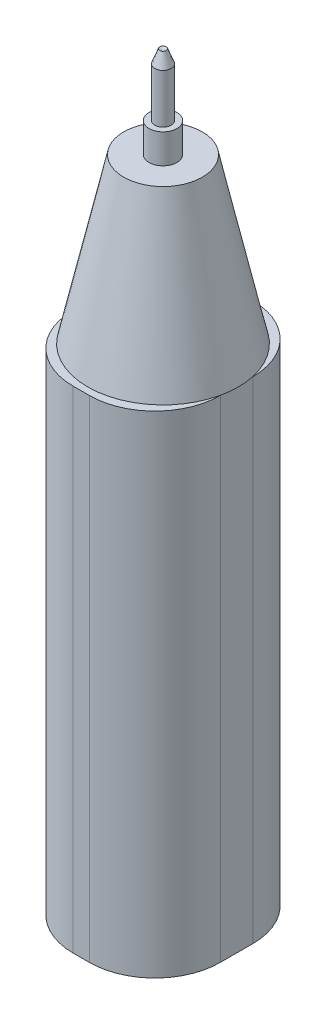
ISO-10303-21;
HEADER;
FILE_DESCRIPTION(('STEP AP214'),'2;1');
FILE_NAME('part.step','',(''),(''),'','','');
FILE_SCHEMA(('AUTOMOTIVE_DESIGN { 1 0 10303 214 1 1 1 1 }'));
ENDSEC;
DATA;
#1=APPLICATION_CONTEXT('core data for automotive mechanical design processes');
#2=APPLICATION_PROTOCOL_DEFINITION('international standard','automotive_design',2000,#1);
#3=PRODUCT_CONTEXT('',#1,'mechanical');
#4=PRODUCT('Part','Part','',(#3));
#5=PRODUCT_RELATED_PRODUCT_CATEGORY('part','',(#4));
#6=PRODUCT_DEFINITION_FORMATION('','',#4);
#7=PRODUCT_DEFINITION_CONTEXT('part definition',#1,'design');
#8=PRODUCT_DEFINITION('design','',#6,#7);
#9=PRODUCT_DEFINITION_SHAPE('','',#8);
#10=(LENGTH_UNIT() NAMED_UNIT(*) SI_UNIT(.MILLI.,.METRE.));
#11=(NAMED_UNIT(*) PLANE_ANGLE_UNIT() SI_UNIT($,.RADIAN.));
#12=(NAMED_UNIT(*) SI_UNIT($,.STERADIAN.) SOLID_ANGLE_UNIT());
#13=UNCERTAINTY_MEASURE_WITH_UNIT(LENGTH_MEASURE(1.E-05),#10,'distance_accuracy_value','');
#14=(GEOMETRIC_REPRESENTATION_CONTEXT(3) GLOBAL_UNCERTAINTY_ASSIGNED_CONTEXT((#13)) GLOBAL_UNIT_ASSIGNED_CONTEXT((#10,
#11,#12)) REPRESENTATION_CONTEXT('',''));
#15=CARTESIAN_POINT('',(0.,0.,0.));
#16=DIRECTION('',(0.,0.,1.));
#17=DIRECTION('',(1.,0.,0.));
#18=AXIS2_PLACEMENT_3D('',#15,#16,#17);
#19=CARTESIAN_POINT('',(0.,209.,0.));
#20=DIRECTION('',(0.,1.,0.));
#21=DIRECTION('',(0.,0.,1.));
#22=AXIS2_PLACEMENT_3D('',#19,#20,#21);
#23=PLANE('',#22);
#24=CARTESIAN_POINT('',(0.,209.,0.));
#25=DIRECTION('',(0.,1.,0.));
#26=DIRECTION('',(0.,0.,1.));
#27=AXIS2_PLACEMENT_3D('',#24,#25,#26);
#28=CIRCLE('',#27,4.25);
#29=CARTESIAN_POINT('',(0.,209.,4.25));
#30=VERTEX_POINT('',#29);
#31=EDGE_CURVE('E284',#30,#30,#28,.T.);
#32=ORIENTED_EDGE('',*,*,#31,.T.);
#33=EDGE_LOOP('',(#32));
#34=FACE_BOUND('',#33,.T.);
#35=CARTESIAN_POINT('',(0.,209.,0.));
#36=DIRECTION('',(0.,1.,0.));
#37=DIRECTION('',(0.,0.,1.));
#38=AXIS2_PLACEMENT_3D('',#35,#36,#37);
#39=CIRCLE('',#38,2.5);
#40=CARTESIAN_POINT('',(0.,209.,2.5));
#41=VERTEX_POINT('',#40);
#42=EDGE_CURVE('E294',#41,#41,#39,.T.);
#43=ORIENTED_EDGE('',*,*,#42,.F.);
#44=EDGE_LOOP('',(#43));
#45=FACE_BOUND('',#44,.T.);
#46=ADVANCED_FACE('F34',(#34,#45),#23,.T.);
#47=CARTESIAN_POINT('',(0.,200.,12.));
#48=DIRECTION('',(0.,1.,0.));
#49=DIRECTION('',(0.,0.,1.));
#50=AXIS2_PLACEMENT_3D('',#47,#48,#49);
#51=PLANE('',#50);
#52=CARTESIAN_POINT('',(0.,200.,0.));
#53=DIRECTION('',(0.,-1.,0.));
#54=DIRECTION('',(0.,0.,-1.));
#55=AXIS2_PLACEMENT_3D('',#52,#53,#54);
#56=CIRCLE('',#55,12.);
#57=CARTESIAN_POINT('',(0.,200.,-12.));
#58=VERTEX_POINT('',#57);
#59=EDGE_CURVE('E291',#58,#58,#56,.T.);
#60=ORIENTED_EDGE('',*,*,#59,.F.);
#61=EDGE_LOOP('',(#60));
#62=FACE_BOUND('',#61,.T.);
#63=CARTESIAN_POINT('',(0.,200.,0.));
#64=DIRECTION('',(0.,1.,0.));
#65=DIRECTION('',(0.,0.,1.));
#66=AXIS2_PLACEMENT_3D('',#63,#64,#65);
#67=CIRCLE('',#66,4.25);
#68=CARTESIAN_POINT('',(0.,200.,4.25));
#69=VERTEX_POINT('',#68);
#70=EDGE_CURVE('E287',#69,#69,#67,.T.);
#71=ORIENTED_EDGE('',*,*,#70,.F.);
#72=EDGE_LOOP('',(#71));
#73=FACE_BOUND('',#72,.T.);
#74=ADVANCED_FACE('F262',(#62,#73),#51,.T.);
#75=CARTESIAN_POINT('',(2.5,150.,-5.));
#76=DIRECTION('',(0.,-1.,0.));
#77=DIRECTION('',(0.,0.,-1.));
#78=AXIS2_PLACEMENT_3D('',#75,#76,#77);
#79=PLANE('',#78);
#80=DIRECTION('',(0.,0.,-1.));
#81=VECTOR('',#80,1.);
#82=CARTESIAN_POINT('',(22.5,150.,5.));
#83=LINE('',#82,#81);
#84=CARTESIAN_POINT('',(22.5,150.,5.));
#85=VERTEX_POINT('',#84);
#86=CARTESIAN_POINT('',(22.5,150.,4.76969600708471));
#87=VERTEX_POINT('',#86);
#88=EDGE_CURVE('E144',#85,#87,#83,.T.);
#89=ORIENTED_EDGE('',*,*,#88,.T.);
#90=CARTESIAN_POINT('',(0.,150.,0.));
#91=DIRECTION('',(0.,-1.,0.));
#92=DIRECTION('',(0.,0.,-1.));
#93=AXIS2_PLACEMENT_3D('',#90,#91,#92);
#94=CIRCLE('',#93,23.);
#95=CARTESIAN_POINT('',(-22.5,150.,4.76969600708475));
#96=VERTEX_POINT('',#95);
#97=EDGE_CURVE('E181',#87,#96,#94,.T.);
#98=ORIENTED_EDGE('',*,*,#97,.T.);
#99=DIRECTION('',(0.,0.,1.));
#100=VECTOR('',#99,1.);
#101=CARTESIAN_POINT('',(-22.5,150.,5.));
#102=LINE('',#101,#100);
#103=CARTESIAN_POINT('',(-22.5,150.,5.));
#104=VERTEX_POINT('',#103);
#105=EDGE_CURVE('E188',#96,#104,#102,.T.);
#106=ORIENTED_EDGE('',*,*,#105,.T.);
#107=CARTESIAN_POINT('',(-2.5,150.,5.));
#108=DIRECTION('',(0.,1.,0.));
#109=DIRECTION('',(0.,0.,-1.));
#110=AXIS2_PLACEMENT_3D('',#107,#108,#109);
#111=CIRCLE('',#110,20.);
#112=CARTESIAN_POINT('',(-2.49999999999999,150.,25.));
#113=VERTEX_POINT('',#112);
#114=EDGE_CURVE('E126',#104,#113,#111,.T.);
#115=ORIENTED_EDGE('',*,*,#114,.T.);
#116=DIRECTION('',(1.,0.,0.));
#117=VECTOR('',#116,1.);
#118=CARTESIAN_POINT('',(-2.5,150.,25.));
#119=LINE('',#118,#117);
#120=CARTESIAN_POINT('',(2.5,150.,25.));
#121=VERTEX_POINT('',#120);
#122=EDGE_CURVE('E118',#113,#121,#119,.T.);
#123=ORIENTED_EDGE('',*,*,#122,.T.);
#124=CARTESIAN_POINT('',(2.5,150.,5.));
#125=DIRECTION('',(0.,1.,0.));
#126=DIRECTION('',(0.,0.,1.));
#127=AXIS2_PLACEMENT_3D('',#124,#125,#126);
#128=CIRCLE('',#127,20.);
#129=EDGE_CURVE('E123',#121,#85,#128,.T.);
#130=ORIENTED_EDGE('',*,*,#129,.T.);
#131=EDGE_LOOP('',(#89,#98,#106,#115,#123,#130));
#132=FACE_BOUND('',#131,.T.);
#133=ADVANCED_FACE('F121',(#132),#79,.F.);
#134=CARTESIAN_POINT('',(2.5,150.,-5.));
#135=DIRECTION('',(0.,-1.,0.));
#136=DIRECTION('',(0.,0.,-1.));
#137=AXIS2_PLACEMENT_3D('',#134,#135,#136);
#138=CYLINDRICAL_SURFACE('',#137,20.);
#139=CARTESIAN_POINT('',(2.5,0.,-5.));
#140=DIRECTION('',(0.,1.,0.));
#141=DIRECTION('',(0.,0.,-1.));
#142=AXIS2_PLACEMENT_3D('',#139,#140,#141);
#143=CIRCLE('',#142,20.);
#144=CARTESIAN_POINT('',(22.5,0.,-5.));
#145=VERTEX_POINT('',#144);
#146=CARTESIAN_POINT('',(2.5,0.,-25.));
#147=VERTEX_POINT('',#146);
#148=EDGE_CURVE('E149',#145,#147,#143,.T.);
#149=ORIENTED_EDGE('',*,*,#148,.T.);
#150=DIRECTION('',(0.,-1.,0.));
#151=VECTOR('',#150,1.);
#152=CARTESIAN_POINT('',(2.5,150.,-25.));
#153=LINE('',#152,#151);
#154=CARTESIAN_POINT('',(2.5,150.,-25.));
#155=VERTEX_POINT('',#154);
#156=EDGE_CURVE('E178',#155,#147,#153,.T.);
#157=ORIENTED_EDGE('',*,*,#156,.F.);
#158=CARTESIAN_POINT('',(2.5,150.,-5.));
#159=DIRECTION('',(0.,1.,0.));
#160=DIRECTION('',(0.,0.,-1.));
#161=AXIS2_PLACEMENT_3D('',#158,#159,#160);
#162=CIRCLE('',#161,20.);
#163=CARTESIAN_POINT('',(22.5,150.,-5.));
#164=VERTEX_POINT('',#163);
#165=EDGE_CURVE('E165',#164,#155,#162,.T.);
#166=ORIENTED_EDGE('',*,*,#165,.F.);
#167=DIRECTION('',(0.,-1.,0.));
#168=VECTOR('',#167,1.);
#169=CARTESIAN_POINT('',(22.5,150.,-5.));
#170=LINE('',#169,#168);
#171=EDGE_CURVE('E148',#164,#145,#170,.T.);
#172=ORIENTED_EDGE('',*,*,#171,.T.);
#173=EDGE_LOOP('',(#149,#157,#166,#172));
#174=FACE_BOUND('',#173,.T.);
#175=ADVANCED_FACE('F36',(#174),#138,.T.);
#176=CARTESIAN_POINT('',(-2.5,150.,-25.));
#177=DIRECTION('',(0.,0.,1.));
#178=DIRECTION('',(1.,0.,0.));
#179=AXIS2_PLACEMENT_3D('',#176,#177,#178);
#180=PLANE('',#179);
#181=DIRECTION('',(-1.,0.,0.));
#182=VECTOR('',#181,1.);
#183=CARTESIAN_POINT('',(-2.5,0.,-25.));
#184=LINE('',#183,#182);
#185=CARTESIAN_POINT('',(-2.5,0.,-25.));
#186=VERTEX_POINT('',#185);
#187=EDGE_CURVE('E152',#147,#186,#184,.T.);
#188=ORIENTED_EDGE('',*,*,#187,.T.);
#189=DIRECTION('',(0.,-1.,0.));
#190=VECTOR('',#189,1.);
#191=CARTESIAN_POINT('',(-2.5,150.,-25.));
#192=LINE('',#191,#190);
#193=CARTESIAN_POINT('',(-2.5,150.,-25.));
#194=VERTEX_POINT('',#193);
#195=EDGE_CURVE('E175',#194,#186,#192,.T.);
#196=ORIENTED_EDGE('',*,*,#195,.F.);
#197=DIRECTION('',(-1.,0.,0.));
#198=VECTOR('',#197,1.);
#199=CARTESIAN_POINT('',(-2.5,150.,-25.));
#200=LINE('',#199,#198);
#201=EDGE_CURVE('E102',#155,#194,#200,.T.);
#202=ORIENTED_EDGE('',*,*,#201,.F.);
#203=ORIENTED_EDGE('',*,*,#156,.T.);
#204=EDGE_LOOP('',(#188,#196,#202,#203));
#205=FACE_BOUND('',#204,.T.);
#206=ADVANCED_FACE('F430',(#205),#180,.F.);
#207=CARTESIAN_POINT('',(-2.5,150.,-5.));
#208=DIRECTION('',(0.,-1.,0.));
#209=DIRECTION('',(0.,0.,-1.));
#210=AXIS2_PLACEMENT_3D('',#207,#208,#209);
#211=CYLINDRICAL_SURFACE('',#210,20.);
#212=CARTESIAN_POINT('',(-2.5,0.,-5.));
#213=DIRECTION('',(0.,1.,0.));
#214=DIRECTION('',(0.,0.,-1.));
#215=AXIS2_PLACEMENT_3D('',#212,#213,#214);
#216=CIRCLE('',#215,20.);
#217=CARTESIAN_POINT('',(-22.5,0.,-5.));
#218=VERTEX_POINT('',#217);
#219=EDGE_CURVE('E155',#186,#218,#216,.T.);
#220=ORIENTED_EDGE('',*,*,#219,.T.);
#221=DIRECTION('',(0.,-1.,0.));
#222=VECTOR('',#221,1.);
#223=CARTESIAN_POINT('',(-22.5,150.,-5.));
#224=LINE('',#223,#222);
#225=CARTESIAN_POINT('',(-22.5,150.,-5.));
#226=VERTEX_POINT('',#225);
#227=EDGE_CURVE('E172',#226,#218,#224,.T.);
#228=ORIENTED_EDGE('',*,*,#227,.F.);
#229=CARTESIAN_POINT('',(-2.5,150.,-5.));
#230=DIRECTION('',(0.,1.,0.));
#231=DIRECTION('',(0.,0.,-1.));
#232=AXIS2_PLACEMENT_3D('',#229,#230,#231);
#233=CIRCLE('',#232,20.);
#234=EDGE_CURVE('E199',#194,#226,#233,.T.);
#235=ORIENTED_EDGE('',*,*,#234,.F.);
#236=ORIENTED_EDGE('',*,*,#195,.T.);
#237=EDGE_LOOP('',(#220,#228,#235,#236));
#238=FACE_BOUND('',#237,.T.);
#239=ADVANCED_FACE('F260',(#238),#211,.T.);
#240=CARTESIAN_POINT('',(-22.5,150.,5.));
#241=DIRECTION('',(1.,0.,0.));
#242=DIRECTION('',(0.,0.,-1.));
#243=AXIS2_PLACEMENT_3D('',#240,#241,#242);
#244=PLANE('',#243);
#245=ORIENTED_EDGE('',*,*,#105,.F.);
#246=CARTESIAN_POINT('',(-22.5,150.945176721953,15.4543097989332));
#247=CARTESIAN_POINT('',(-22.5,150.845980501769,14.6577788421554));
#248=CARTESIAN_POINT('',(-22.5,150.75187678349,13.8605854725635));
#249=CARTESIAN_POINT('',(-22.5,150.575600378426,12.264800911085));
#250=CARTESIAN_POINT('',(-22.5,150.493428937328,11.4662095820513));
#251=CARTESIAN_POINT('',(-22.5,150.342741917008,9.86726999008047));
#252=CARTESIAN_POINT('',(-22.5,150.274234092261,9.06692098861855));
#253=CARTESIAN_POINT('',(-22.5,150.152710200014,7.46506272895871));
#254=CARTESIAN_POINT('',(-22.5,150.099693648549,6.66355350779385));
#255=CARTESIAN_POINT('',(-22.5,150.01100834859,5.06448081675172));
#256=CARTESIAN_POINT('',(-22.5,149.975235530714,4.26692317911145));
#257=CARTESIAN_POINT('',(-22.5,149.921742679699,2.67119239229187));
#258=CARTESIAN_POINT('',(-22.5,149.904022723623,1.87301924049972));
#259=CARTESIAN_POINT('',(-22.5,149.887267808071,0.276745352921903));
#260=CARTESIAN_POINT('',(-22.5,149.888226507818,-0.521355315469857));
#261=CARTESIAN_POINT('',(-22.5,149.908778500561,-2.1173127064276));
#262=CARTESIAN_POINT('',(-22.5,149.92837177977,-2.91516942917364));
#263=CARTESIAN_POINT('',(-22.5,149.985445532975,-4.50867247638517));
#264=CARTESIAN_POINT('',(-22.5,150.022890891288,-5.30432006912813));
#265=CARTESIAN_POINT('',(-22.5,150.114429989795,-6.89464315198481));
#266=CARTESIAN_POINT('',(-22.5,150.168523805536,-7.68931863767081));
#267=CARTESIAN_POINT('',(-22.5,150.35347056711,-10.0721933256358));
#268=CARTESIAN_POINT('',(-22.5,150.506965952494,-11.6586618309659));
#269=CARTESIAN_POINT('',(-22.5,150.772621907205,-14.0393700568456));
#270=CARTESIAN_POINT('',(-22.5,150.867436059315,-14.8356512590343));
#271=CARTESIAN_POINT('',(-22.5,151.067181177781,-16.4269649488708));
#272=CARTESIAN_POINT('',(-22.5,151.172112277468,-17.2219974199212));
#273=CARTESIAN_POINT('',(-22.5,151.390490029936,-18.8101281831261));
#274=CARTESIAN_POINT('',(-22.5,151.503928675793,-19.6032275862709));
#275=CARTESIAN_POINT('',(-22.5,151.738148867487,-21.1882995191685));
#276=CARTESIAN_POINT('',(-22.5,151.858930015869,-21.9802721075458));
#277=CARTESIAN_POINT('',(-22.5,151.982759556714,-22.7717574524419));
#278=B_SPLINE_CURVE_WITH_KNOTS('',3,(#246,#247,#248,#249,#250,#251,#252,#253,#254,#255,#256,
#257,#258,#259,#260,#261,#262,#263,#264,#265,#266,#267,#268,#269,#270,#271,#272,#273,#274,#275,
#276,#277),.UNSPECIFIED.,.F.,.F.,(4,2,2,2,2,2,2,2,2,2,2,2,2,2,2,4),(0.,2.40807719463847,
4.81640560355429,7.2260969393524,9.63571298534146,12.0305985537837,14.425494345081,
16.8195771636341,19.2136582108195,21.6030493233625,23.9924512788339,28.7729921094097,
31.1786754563544,33.5843905122083,35.9878691631506,38.3912178277757),.UNSPECIFIED.);
#279=CARTESIAN_POINT('',(-22.5,150.,-4.76969600708475));
#280=VERTEX_POINT('',#279);
#281=EDGE_CURVE('E153',#96,#280,#278,.T.);
#282=ORIENTED_EDGE('',*,*,#281,.T.);
#283=EDGE_CURVE('E198',#226,#280,#102,.T.);
#284=ORIENTED_EDGE('',*,*,#283,.F.);
#285=ORIENTED_EDGE('',*,*,#227,.T.);
#286=DIRECTION('',(0.,0.,1.));
#287=VECTOR('',#286,1.);
#288=CARTESIAN_POINT('',(-22.5,0.,5.));
#289=LINE('',#288,#287);
#290=CARTESIAN_POINT('',(-22.5,0.,5.));
#291=VERTEX_POINT('',#290);
#292=EDGE_CURVE('E157',#218,#291,#289,.T.);
#293=ORIENTED_EDGE('',*,*,#292,.T.);
#294=DIRECTION('',(0.,-1.,0.));
#295=VECTOR('',#294,1.);
#296=CARTESIAN_POINT('',(-22.5,150.,5.));
#297=LINE('',#296,#295);
#298=EDGE_CURVE('E169',#104,#291,#297,.T.);
#299=ORIENTED_EDGE('',*,*,#298,.F.);
#300=EDGE_LOOP('',(#245,#282,#284,#285,#293,#299));
#301=FACE_BOUND('',#300,.T.);
#302=ADVANCED_FACE('F195',(#301),#244,.F.);
#303=CARTESIAN_POINT('',(-2.5,150.,5.));
#304=DIRECTION('',(0.,-1.,0.));
#305=DIRECTION('',(0.,0.,-1.));
#306=AXIS2_PLACEMENT_3D('',#303,#304,#305);
#307=CYLINDRICAL_SURFACE('',#306,20.);
#308=CARTESIAN_POINT('',(-2.5,0.,5.));
#309=DIRECTION('',(0.,1.,0.));
#310=DIRECTION('',(0.,0.,-1.));
#311=AXIS2_PLACEMENT_3D('',#308,#309,#310);
#312=CIRCLE('',#311,20.);
#313=CARTESIAN_POINT('',(-2.49999999999999,0.,25.));
#314=VERTEX_POINT('',#313);
#315=EDGE_CURVE('E159',#291,#314,#312,.T.);
#316=ORIENTED_EDGE('',*,*,#315,.T.);
#317=DIRECTION('',(0.,-1.,0.));
#318=VECTOR('',#317,1.);
#319=CARTESIAN_POINT('',(-2.49999999999999,150.,25.));
#320=LINE('',#319,#318);
#321=EDGE_CURVE('E138',#113,#314,#320,.T.);
#322=ORIENTED_EDGE('',*,*,#321,.F.);
#323=ORIENTED_EDGE('',*,*,#114,.F.);
#324=ORIENTED_EDGE('',*,*,#298,.T.);
#325=EDGE_LOOP('',(#316,#322,#323,#324));
#326=FACE_BOUND('',#325,.T.);
#327=ADVANCED_FACE('F254',(#326),#307,.T.);
#328=CARTESIAN_POINT('',(-2.5,150.,25.));
#329=DIRECTION('',(0.,0.,-1.));
#330=DIRECTION('',(-1.,0.,0.));
#331=AXIS2_PLACEMENT_3D('',#328,#329,#330);
#332=PLANE('',#331);
#333=DIRECTION('',(1.,0.,0.));
#334=VECTOR('',#333,1.);
#335=CARTESIAN_POINT('',(-2.5,0.,25.));
#336=LINE('',#335,#334);
#337=CARTESIAN_POINT('',(2.5,0.,25.));
#338=VERTEX_POINT('',#337);
#339=EDGE_CURVE('E135',#314,#338,#336,.T.);
#340=ORIENTED_EDGE('',*,*,#339,.T.);
#341=DIRECTION('',(0.,-1.,0.));
#342=VECTOR('',#341,1.);
#343=CARTESIAN_POINT('',(2.5,150.,25.));
#344=LINE('',#343,#342);
#345=EDGE_CURVE('E132',#121,#338,#344,.T.);
#346=ORIENTED_EDGE('',*,*,#345,.F.);
#347=ORIENTED_EDGE('',*,*,#122,.F.);
#348=ORIENTED_EDGE('',*,*,#321,.T.);
#349=EDGE_LOOP('',(#340,#346,#347,#348));
#350=FACE_BOUND('',#349,.T.);
#351=ADVANCED_FACE('F133',(#350),#332,.F.);
#352=CARTESIAN_POINT('',(2.5,150.,5.));
#353=DIRECTION('',(0.,-1.,0.));
#354=DIRECTION('',(0.,0.,-1.));
#355=AXIS2_PLACEMENT_3D('',#352,#353,#354);
#356=CYLINDRICAL_SURFACE('',#355,20.);
#357=CARTESIAN_POINT('',(2.5,0.,5.));
#358=DIRECTION('',(0.,1.,0.));
#359=DIRECTION('',(0.,0.,1.));
#360=AXIS2_PLACEMENT_3D('',#357,#358,#359);
#361=CIRCLE('',#360,20.);
#362=CARTESIAN_POINT('',(22.5,0.,5.));
#363=VERTEX_POINT('',#362);
#364=EDGE_CURVE('E162',#338,#363,#361,.T.);
#365=ORIENTED_EDGE('',*,*,#364,.T.);
#366=DIRECTION('',(0.,-1.,0.));
#367=VECTOR('',#366,1.);
#368=CARTESIAN_POINT('',(22.5,150.,5.));
#369=LINE('',#368,#367);
#370=EDGE_CURVE('E139',#85,#363,#369,.T.);
#371=ORIENTED_EDGE('',*,*,#370,.F.);
#372=ORIENTED_EDGE('',*,*,#129,.F.);
#373=ORIENTED_EDGE('',*,*,#345,.T.);
#374=EDGE_LOOP('',(#365,#371,#372,#373));
#375=FACE_BOUND('',#374,.T.);
#376=ADVANCED_FACE('F141',(#375),#356,.T.);
#377=CARTESIAN_POINT('',(22.5,150.,5.));
#378=DIRECTION('',(-1.,0.,0.));
#379=DIRECTION('',(0.,0.,1.));
#380=AXIS2_PLACEMENT_3D('',#377,#378,#379);
#381=PLANE('',#380);
#382=CARTESIAN_POINT('',(22.5,150.,-4.76969600708471));
#383=VERTEX_POINT('',#382);
#384=EDGE_CURVE('E59',#383,#164,#83,.T.);
#385=ORIENTED_EDGE('',*,*,#384,.F.);
#386=CARTESIAN_POINT('',(22.5,151.982759556714,-22.7717574524419));
#387=CARTESIAN_POINT('',(22.5,151.858930015869,-21.9802721075458));
#388=CARTESIAN_POINT('',(22.5,151.738148867487,-21.1882995191685));
#389=CARTESIAN_POINT('',(22.5,151.503928675793,-19.6032275862709));
#390=CARTESIAN_POINT('',(22.5,151.390490029936,-18.8101281831261));
#391=CARTESIAN_POINT('',(22.5,151.172112277468,-17.2219974199212));
#392=CARTESIAN_POINT('',(22.5,151.067181177781,-16.4269649488708));
#393=CARTESIAN_POINT('',(22.5,150.867436059315,-14.8356512590343));
#394=CARTESIAN_POINT('',(22.5,150.772621907205,-14.0393700568456));
#395=CARTESIAN_POINT('',(22.5,150.506965952494,-11.6586618309659));
#396=CARTESIAN_POINT('',(22.5,150.35347056711,-10.0721933256358));
#397=CARTESIAN_POINT('',(22.5,150.168523805536,-7.68931863767081));
#398=CARTESIAN_POINT('',(22.5,150.114429989795,-6.89464315198481));
#399=CARTESIAN_POINT('',(22.5,150.022890891288,-5.30432006912813));
#400=CARTESIAN_POINT('',(22.5,149.985445532975,-4.50867247638517));
#401=CARTESIAN_POINT('',(22.5,149.92837177977,-2.91516942917363));
#402=CARTESIAN_POINT('',(22.5,149.908778500561,-2.11731270642759));
#403=CARTESIAN_POINT('',(22.5,149.888226507818,-0.52135531546985));
#404=CARTESIAN_POINT('',(22.5,149.887267808071,0.276745352921911));
#405=CARTESIAN_POINT('',(22.5,149.904022723623,1.87301924049973));
#406=CARTESIAN_POINT('',(22.5,149.921742679699,2.67119239229188));
#407=CARTESIAN_POINT('',(22.5,149.975235530714,4.26692317911146));
#408=CARTESIAN_POINT('',(22.5,150.01100834859,5.06448081675173));
#409=CARTESIAN_POINT('',(22.5,150.099693648549,6.66355350779385));
#410=CARTESIAN_POINT('',(22.5,150.152710200014,7.46506272895871));
#411=CARTESIAN_POINT('',(22.5,150.274234092261,9.06692098861856));
#412=CARTESIAN_POINT('',(22.5,150.342741917008,9.86726999008047));
#413=CARTESIAN_POINT('',(22.5,150.493428937328,11.4662095820513));
#414=CARTESIAN_POINT('',(22.5,150.575600378426,12.264800911085));
#415=CARTESIAN_POINT('',(22.5,150.75187678349,13.8605854725635));
#416=CARTESIAN_POINT('',(22.5,150.845980501769,14.6577788421554));
#417=CARTESIAN_POINT('',(22.5,150.945176721953,15.4543097989332));
#418=B_SPLINE_CURVE_WITH_KNOTS('',3,(#386,#387,#388,#389,#390,#391,#392,#393,#394,#395,#396,
#397,#398,#399,#400,#401,#402,#403,#404,#405,#406,#407,#408,#409,#410,#411,#412,#413,#414,#415,
#416,#417),.UNSPECIFIED.,.F.,.F.,(4,2,2,2,2,2,2,2,2,2,2,2,2,2,2,4),(0.,2.40334866462515,
4.80682731556738,7.21254237142134,9.61822571836606,14.3987665489418,16.7881685044132,
19.1775596169563,21.5716406641416,23.9657234826947,26.360619273992,28.7555048424343,
31.1651208884233,33.5748122242214,35.9831406331373,38.3912178277757),.UNSPECIFIED.);
#419=EDGE_CURVE('E211',#383,#87,#418,.T.);
#420=ORIENTED_EDGE('',*,*,#419,.T.);
#421=ORIENTED_EDGE('',*,*,#88,.F.);
#422=ORIENTED_EDGE('',*,*,#370,.T.);
#423=DIRECTION('',(0.,0.,-1.));
#424=VECTOR('',#423,1.);
#425=CARTESIAN_POINT('',(22.5,0.,5.));
#426=LINE('',#425,#424);
#427=EDGE_CURVE('E93',#363,#145,#426,.T.);
#428=ORIENTED_EDGE('',*,*,#427,.T.);
#429=ORIENTED_EDGE('',*,*,#171,.F.);
#430=EDGE_LOOP('',(#385,#420,#421,#422,#428,#429));
#431=FACE_BOUND('',#430,.T.);
#432=ADVANCED_FACE('F245',(#431),#381,.F.);
#433=ORIENTED_EDGE('',*,*,#283,.T.);
#434=EDGE_CURVE('E180',#280,#383,#94,.T.);
#435=ORIENTED_EDGE('',*,*,#434,.T.);
#436=ORIENTED_EDGE('',*,*,#384,.T.);
#437=ORIENTED_EDGE('',*,*,#165,.T.);
#438=ORIENTED_EDGE('',*,*,#201,.T.);
#439=ORIENTED_EDGE('',*,*,#234,.T.);
#440=EDGE_LOOP('',(#433,#435,#436,#437,#438,#439));
#441=FACE_BOUND('',#440,.T.);
#442=ADVANCED_FACE('F241',(#441),#79,.F.);
#443=CARTESIAN_POINT('',(2.5,0.,-5.));
#444=DIRECTION('',(0.,-1.,0.));
#445=DIRECTION('',(0.,0.,-1.));
#446=AXIS2_PLACEMENT_3D('',#443,#444,#445);
#447=PLANE('',#446);
#448=ORIENTED_EDGE('',*,*,#148,.F.);
#449=ORIENTED_EDGE('',*,*,#427,.F.);
#450=ORIENTED_EDGE('',*,*,#364,.F.);
#451=ORIENTED_EDGE('',*,*,#339,.F.);
#452=ORIENTED_EDGE('',*,*,#315,.F.);
#453=ORIENTED_EDGE('',*,*,#292,.F.);
#454=ORIENTED_EDGE('',*,*,#219,.F.);
#455=ORIENTED_EDGE('',*,*,#187,.F.);
#456=EDGE_LOOP('',(#448,#449,#450,#451,#452,#453,#454,#455));
#457=FACE_BOUND('',#456,.T.);
#458=ADVANCED_FACE('F244',(#457),#447,.T.);
#459=CARTESIAN_POINT('',(0.,150.,0.));
#460=DIRECTION('',(0.,-1.,0.));
#461=DIRECTION('',(0.,0.,-1.));
#462=AXIS2_PLACEMENT_3D('',#459,#460,#461);
#463=CONICAL_SURFACE('',#462,23.,0.216550304976089);
#464=ORIENTED_EDGE('',*,*,#59,.T.);
#465=EDGE_LOOP('',(#464));
#466=FACE_BOUND('',#465,.T.);
#467=CARTESIAN_POINT('',(0.,150.,0.));
#468=DIRECTION('',(0.,-1.,0.));
#469=DIRECTION('',(0.,0.,-1.));
#470=AXIS2_PLACEMENT_3D('',#467,#468,#469);
#471=CIRCLE('',#470,23.);
#472=EDGE_CURVE('E50',#383,#87,#471,.T.);
#473=ORIENTED_EDGE('',*,*,#472,.F.);
#474=ORIENTED_EDGE('',*,*,#434,.F.);
#475=EDGE_CURVE('E300',#96,#280,#471,.T.);
#476=ORIENTED_EDGE('',*,*,#475,.F.);
#477=ORIENTED_EDGE('',*,*,#97,.F.);
#478=EDGE_LOOP('',(#473,#474,#476,#477));
#479=FACE_BOUND('',#478,.T.);
#480=ADVANCED_FACE('F228',(#466,#479),#463,.T.);
#481=CARTESIAN_POINT('',(0.,147.851382173249,0.));
#482=DIRECTION('',(0.,1.,0.));
#483=DIRECTION('',(0.,0.,1.));
#484=AXIS2_PLACEMENT_3D('',#481,#482,#483);
#485=CONICAL_SURFACE('',#484,13.2335553329491,1.35424602181881);
#486=ORIENTED_EDGE('',*,*,#419,.F.);
#487=ORIENTED_EDGE('',*,*,#472,.T.);
#488=EDGE_LOOP('',(#486,#487));
#489=FACE_BOUND('',#488,.T.);
#490=ADVANCED_FACE('F226',(#489),#485,.T.);
#491=ORIENTED_EDGE('',*,*,#281,.F.);
#492=ORIENTED_EDGE('',*,*,#475,.T.);
#493=EDGE_LOOP('',(#491,#492));
#494=FACE_BOUND('',#493,.T.);
#495=ADVANCED_FACE('F220',(#494),#485,.T.);
#496=CARTESIAN_POINT('',(0.,209.,0.));
#497=DIRECTION('',(0.,-1.,0.));
#498=DIRECTION('',(0.,0.,-1.));
#499=AXIS2_PLACEMENT_3D('',#496,#497,#498);
#500=CYLINDRICAL_SURFACE('',#499,4.25);
#501=ORIENTED_EDGE('',*,*,#31,.F.);
#502=EDGE_LOOP('',(#501));
#503=FACE_BOUND('',#502,.T.);
#504=ORIENTED_EDGE('',*,*,#70,.T.);
#505=EDGE_LOOP('',(#504));
#506=FACE_BOUND('',#505,.T.);
#507=ADVANCED_FACE('F225',(#503,#506),#500,.T.);
#508=CARTESIAN_POINT('',(0.,224.,0.));
#509=DIRECTION('',(0.,-1.,0.));
#510=DIRECTION('',(0.,0.,-1.));
#511=AXIS2_PLACEMENT_3D('',#508,#509,#510);
#512=CYLINDRICAL_SURFACE('',#511,2.5);
#513=CARTESIAN_POINT('',(0.,224.,0.));
#514=DIRECTION('',(0.,1.,0.));
#515=DIRECTION('',(0.,0.,1.));
#516=AXIS2_PLACEMENT_3D('',#513,#514,#515);
#517=CIRCLE('',#516,2.5);
#518=CARTESIAN_POINT('',(0.,224.,2.5));
#519=VERTEX_POINT('',#518);
#520=EDGE_CURVE('E289',#519,#519,#517,.T.);
#521=ORIENTED_EDGE('',*,*,#520,.F.);
#522=EDGE_LOOP('',(#521));
#523=FACE_BOUND('',#522,.T.);
#524=ORIENTED_EDGE('',*,*,#42,.T.);
#525=EDGE_LOOP('',(#524));
#526=FACE_BOUND('',#525,.T.);
#527=ADVANCED_FACE('F273',(#523,#526),#512,.T.);
#528=CARTESIAN_POINT('',(0.,223.648876558412,0.));
#529=DIRECTION('',(0.,-1.,0.));
#530=DIRECTION('',(0.,0.,-1.));
#531=AXIS2_PLACEMENT_3D('',#528,#529,#530);
#532=CONICAL_SURFACE('',#531,1.56367082243096,0.358770670270572);
#533=CARTESIAN_POINT('',(0.,224.,0.));
#534=DIRECTION('',(0.,1.,0.));
#535=DIRECTION('',(0.,0.,1.));
#536=AXIS2_PLACEMENT_3D('',#533,#534,#535);
#537=CIRCLE('',#536,1.43199953183531);
#538=CARTESIAN_POINT('',(0.,224.,-1.43199953183532));
#539=VERTEX_POINT('',#538);
#540=EDGE_CURVE('E11',#539,#539,#537,.F.);
#541=CARTESIAN_POINT('',(0.,227.648876558412,0.));
#542=DIRECTION('',(0.,1.,0.));
#543=DIRECTION('',(0.,0.,1.));
#544=AXIS2_PLACEMENT_3D('',#541,#542,#543);
#545=CIRCLE('',#544,0.0636708224309556);
#546=CARTESIAN_POINT('',(0.,227.648876558412,-0.0636708224309606));
#547=VERTEX_POINT('',#546);
#548=EDGE_CURVE('E409',#547,#547,#545,.T.);
#549=CARTESIAN_POINT('',(0.,224.,-1.43199953183532));
#550=CARTESIAN_POINT('',(0.,224.038009130817,-1.41774610777902));
#551=CARTESIAN_POINT('',(0.,224.076018261634,-1.40349268372272));
#552=CARTESIAN_POINT('',(0.,224.152036523267,-1.37498583561013));
#553=CARTESIAN_POINT('',(0.,224.190045654084,-1.36073241155384));
#554=CARTESIAN_POINT('',(0.,224.266063915718,-1.33222556344125));
#555=CARTESIAN_POINT('',(0.,224.304073046534,-1.31797213938495));
#556=CARTESIAN_POINT('',(0.,224.380091308168,-1.28946529127236));
#557=CARTESIAN_POINT('',(0.,224.418100438985,-1.27521186721607));
#558=CARTESIAN_POINT('',(0.,224.494118700618,-1.24670501910348));
#559=CARTESIAN_POINT('',(0.,224.532127831435,-1.23245159504718));
#560=CARTESIAN_POINT('',(0.,224.608146093069,-1.20394474693459));
#561=CARTESIAN_POINT('',(0.,224.646155223885,-1.18969132287829));
#562=CARTESIAN_POINT('',(0.,224.722173485519,-1.1611844747657));
#563=CARTESIAN_POINT('',(0.,224.760182616336,-1.14693105070941));
#564=CARTESIAN_POINT('',(0.,224.836200877969,-1.11842420259682));
#565=CARTESIAN_POINT('',(0.,224.874210008786,-1.10417077854052));
#566=CARTESIAN_POINT('',(0.,224.95022827042,-1.07566393042793));
#567=CARTESIAN_POINT('',(0.,224.988237401236,-1.06141050637164));
#568=CARTESIAN_POINT('',(0.,225.06425566287,-1.03290365825905));
#569=CARTESIAN_POINT('',(0.,225.102264793687,-1.01865023420275));
#570=CARTESIAN_POINT('',(0.,225.17828305532,-0.990143386090159));
#571=CARTESIAN_POINT('',(0.,225.216292186137,-0.975889962033864));
#572=CARTESIAN_POINT('',(0.,225.292310447771,-0.947383113921274));
#573=CARTESIAN_POINT('',(0.,225.330319578588,-0.933129689864978));
#574=CARTESIAN_POINT('',(0.,225.406337840221,-0.904622841752387));
#575=CARTESIAN_POINT('',(0.,225.444346971038,-0.890369417696092));
#576=CARTESIAN_POINT('',(0.,225.520365232672,-0.861862569583501));
#577=CARTESIAN_POINT('',(0.,225.558374363488,-0.847609145527206));
#578=CARTESIAN_POINT('',(0.,225.634392625122,-0.819102297414615));
#579=CARTESIAN_POINT('',(0.,225.672401755939,-0.804848873358319));
#580=CARTESIAN_POINT('',(0.,225.748420017572,-0.77634202524573));
#581=CARTESIAN_POINT('',(0.,225.786429148389,-0.762088601189436));
#582=CARTESIAN_POINT('',(0.,225.862447410023,-0.733581753076844));
#583=CARTESIAN_POINT('',(0.,225.900456540839,-0.719328329020547));
#584=CARTESIAN_POINT('',(0.,225.976474802473,-0.690821480907955));
#585=CARTESIAN_POINT('',(0.,226.01448393329,-0.676568056851661));
#586=CARTESIAN_POINT('',(0.,226.090502194923,-0.648061208739071));
#587=CARTESIAN_POINT('',(0.,226.12851132574,-0.633807784682776));
#588=CARTESIAN_POINT('',(0.,226.204529587374,-0.605300936570185));
#589=CARTESIAN_POINT('',(0.,226.242538718191,-0.591047512513889));
#590=CARTESIAN_POINT('',(0.,226.318556979824,-0.562540664401299));
#591=CARTESIAN_POINT('',(0.,226.356566110641,-0.548287240345003));
#592=CARTESIAN_POINT('',(0.,226.432584372274,-0.519780392232412));
#593=CARTESIAN_POINT('',(0.,226.470593503091,-0.505526968176117));
#594=CARTESIAN_POINT('',(0.,226.546611764725,-0.477020120063527));
#595=CARTESIAN_POINT('',(0.,226.584620895542,-0.462766696007233));
#596=CARTESIAN_POINT('',(0.,226.660639157175,-0.434259847894642));
#597=CARTESIAN_POINT('',(0.,226.698648287992,-0.420006423838344));
#598=CARTESIAN_POINT('',(0.,226.774666549625,-0.391499575725752));
#599=CARTESIAN_POINT('',(0.,226.812675680442,-0.377246151669458));
#600=CARTESIAN_POINT('',(0.,226.888693942076,-0.348739303556869));
#601=CARTESIAN_POINT('',(0.,226.926703072893,-0.334485879500573));
#602=CARTESIAN_POINT('',(0.,227.002721334526,-0.305979031387982));
#603=CARTESIAN_POINT('',(0.,227.040730465343,-0.291725607331687));
#604=CARTESIAN_POINT('',(0.,227.116748726977,-0.263218759219096));
#605=CARTESIAN_POINT('',(0.,227.154757857793,-0.2489653351628));
#606=CARTESIAN_POINT('',(0.,227.230776119427,-0.22045848705021));
#607=CARTESIAN_POINT('',(0.,227.268785250244,-0.206205062993914));
#608=CARTESIAN_POINT('',(0.,227.344803511877,-0.177698214881324));
#609=CARTESIAN_POINT('',(0.,227.382812642694,-0.163444790825028));
#610=CARTESIAN_POINT('',(0.,227.458830904328,-0.134937942712438));
#611=CARTESIAN_POINT('',(0.,227.496840035145,-0.120684518656142));
#612=CARTESIAN_POINT('',(0.,227.572858296778,-0.0921776705435514));
#613=CARTESIAN_POINT('',(0.,227.610867427595,-0.077924246487256));
#614=CARTESIAN_POINT('',(0.,227.648876558412,-0.0636708224309606));
#615=B_SPLINE_CURVE_WITH_KNOTS('',3,(#549,#550,#551,#552,#553,#554,#555,#556,#557,#558,#559,
#560,#561,#562,#563,#564,#565,#566,#567,#568,#569,#570,#571,#572,#573,#574,#575,#576,#577,#578,
#579,#580,#581,#582,#583,#584,#585,#586,#587,#588,#589,#590,#591,#592,#593,#594,#595,#596,#597,
#598,#599,#600,#601,#602,#603,#604,#605,#606,#607,#608,#609,#610,#611,#612,#613,#614),
.UNSPECIFIED.,.F.,.F.,(4,2,2,2,2,2,2,2,2,2,2,2,2,2,2,2,2,2,2,2,2,2,2,2,2,2,2,2,2,2,2,2,4),(0.,
0.121781308520564,0.243562617041154,0.365343925561744,0.487125234082334,0.608906542602924,
0.730687851123514,0.852469159644104,0.974250468164668,1.09603177668526,1.21781308520585,
1.33959439372644,1.46137570224703,1.58315701076762,1.70493831928821,1.8267196278088,
1.94850093632939,2.07028224484995,2.19206355337054,2.31384486189113,2.43562617041172,
2.55740747893231,2.6791887874529,2.80097009597349,2.92275140449405,3.04453271301464,
3.16631402153523,3.28809533005582,3.40987663857641,3.531657947097,3.65343925561759,
3.77522056413818,3.89700187265877),.UNSPECIFIED.);
#616=EDGE_CURVE('BSEAM280',#539,#547,#615,.T.);
#617=ORIENTED_EDGE('',*,*,#540,.T.);
#618=ORIENTED_EDGE('',*,*,#548,.T.);
#619=ORIENTED_EDGE('',*,*,#616,.T.);
#620=ORIENTED_EDGE('',*,*,#616,.F.);
#621=EDGE_LOOP('',(#617,#619,#618,#620));
#622=FACE_BOUND('',#621,.T.);
#623=ADVANCED_FACE('F280',(#622),#532,.F.);
#624=CARTESIAN_POINT('',(0.,224.,0.));
#625=DIRECTION('',(0.,-1.,0.));
#626=DIRECTION('',(0.,0.,-1.));
#627=AXIS2_PLACEMENT_3D('',#624,#625,#626);
#628=CONICAL_SURFACE('',#627,2.5,0.358770670270572);
#629=CARTESIAN_POINT('',(0.,228.,0.));
#630=DIRECTION('',(0.,1.,0.));
#631=DIRECTION('',(0.,0.,1.));
#632=AXIS2_PLACEMENT_3D('',#629,#630,#631);
#633=CIRCLE('',#632,1.);
#634=CARTESIAN_POINT('',(0.,228.,1.));
#635=VERTEX_POINT('',#634);
#636=EDGE_CURVE('E410',#635,#635,#633,.T.);
#637=ORIENTED_EDGE('',*,*,#636,.F.);
#638=EDGE_LOOP('',(#637));
#639=FACE_BOUND('',#638,.T.);
#640=ORIENTED_EDGE('',*,*,#520,.T.);
#641=EDGE_LOOP('',(#640));
#642=FACE_BOUND('',#641,.T.);
#643=ADVANCED_FACE('F374',(#639,#642),#628,.T.);
#644=CARTESIAN_POINT('',(0.,228.,0.));
#645=DIRECTION('',(0.,1.,0.));
#646=DIRECTION('',(0.,0.,1.));
#647=AXIS2_PLACEMENT_3D('',#644,#645,#646);
#648=CONICAL_SURFACE('',#647,1.,1.21202565652433);
#649=ORIENTED_EDGE('',*,*,#548,.F.);
#650=EDGE_LOOP('',(#649));
#651=FACE_BOUND('',#650,.T.);
#652=ORIENTED_EDGE('',*,*,#636,.T.);
#653=EDGE_LOOP('',(#652));
#654=FACE_BOUND('',#653,.T.);
#655=ADVANCED_FACE('F384',(#651,#654),#648,.F.);
#656=CARTESIAN_POINT('',(0.,224.,0.));
#657=DIRECTION('',(0.,1.,0.));
#658=DIRECTION('',(0.,0.,1.));
#659=AXIS2_PLACEMENT_3D('',#656,#657,#658);
#660=PLANE('',#659);
#661=ORIENTED_EDGE('',*,*,#540,.F.);
#662=EDGE_LOOP('',(#661));
#663=FACE_BOUND('',#662,.T.);
#664=ADVANCED_FACE('F394',(#663),#660,.T.);
#665=CLOSED_SHELL('',(#46,#74,#133,#175,#206,#239,#302,#327,#351,#376,#432,#442,#458,#480,#490,
#495,#507,#527,#623,#643,#655,#664));
#666=CARTESIAN_POINT('',(0.,147.851382173249,0.));
#667=DIRECTION('',(0.,-1.,0.));
#668=DIRECTION('',(0.,0.,-1.));
#669=AXIS2_PLACEMENT_3D('',#666,#667,#668);
#670=CONICAL_SURFACE('',#669,13.2335553329491,0.216550304976089);
#671=CARTESIAN_POINT('',(0.,190.,0.));
#672=DIRECTION('',(0.,-1.,0.));
#673=DIRECTION('',(0.,0.,-1.));
#674=AXIS2_PLACEMENT_3D('',#671,#672,#673);
#675=CIRCLE('',#674,3.96085941106385);
#676=CARTESIAN_POINT('',(0.,190.,-3.96085941106384));
#677=VERTEX_POINT('',#676);
#678=EDGE_CURVE('E301',#677,#677,#675,.T.);
#679=CARTESIAN_POINT('',(0.,150.,0.));
#680=DIRECTION('',(0.,-1.,0.));
#681=DIRECTION('',(0.,0.,-1.));
#682=AXIS2_PLACEMENT_3D('',#679,#680,#681);
#683=CIRCLE('',#682,12.7608594110638);
#684=CARTESIAN_POINT('',(0.,150.,-12.7608594110638));
#685=VERTEX_POINT('',#684);
#686=EDGE_CURVE('E43',#685,#685,#683,.T.);
#687=CARTESIAN_POINT('',(0.,190.,-3.96085941106384));
#688=CARTESIAN_POINT('',(0.,189.583333333333,-4.05252607773052));
#689=CARTESIAN_POINT('',(0.,189.166666666667,-4.14419274439718));
#690=CARTESIAN_POINT('',(0.,188.333333333333,-4.32752607773051));
#691=CARTESIAN_POINT('',(0.,187.916666666667,-4.41919274439717));
#692=CARTESIAN_POINT('',(0.,187.083333333333,-4.60252607773051));
#693=CARTESIAN_POINT('',(0.,186.666666666667,-4.69419274439718));
#694=CARTESIAN_POINT('',(0.,185.833333333333,-4.87752607773051));
#695=CARTESIAN_POINT('',(0.,185.416666666667,-4.96919274439717));
#696=CARTESIAN_POINT('',(0.,184.583333333333,-5.15252607773051));
#697=CARTESIAN_POINT('',(0.,184.166666666667,-5.24419274439717));
#698=CARTESIAN_POINT('',(0.,183.333333333333,-5.42752607773051));
#699=CARTESIAN_POINT('',(0.,182.916666666667,-5.51919274439717));
#700=CARTESIAN_POINT('',(0.,182.083333333333,-5.70252607773051));
#701=CARTESIAN_POINT('',(0.,181.666666666667,-5.79419274439717));
#702=CARTESIAN_POINT('',(0.,180.833333333333,-5.97752607773051));
#703=CARTESIAN_POINT('',(0.,180.416666666667,-6.06919274439717));
#704=CARTESIAN_POINT('',(0.,179.583333333333,-6.25252607773051));
#705=CARTESIAN_POINT('',(0.,179.166666666667,-6.34419274439717));
#706=CARTESIAN_POINT('',(0.,178.333333333333,-6.52752607773051));
#707=CARTESIAN_POINT('',(0.,177.916666666667,-6.61919274439717));
#708=CARTESIAN_POINT('',(0.,177.083333333333,-6.80252607773051));
#709=CARTESIAN_POINT('',(0.,176.666666666667,-6.89419274439717));
#710=CARTESIAN_POINT('',(0.,175.833333333333,-7.07752607773051));
#711=CARTESIAN_POINT('',(0.,175.416666666667,-7.16919274439717));
#712=CARTESIAN_POINT('',(0.,174.583333333333,-7.35252607773051));
#713=CARTESIAN_POINT('',(0.,174.166666666667,-7.44419274439717));
#714=CARTESIAN_POINT('',(0.,173.333333333333,-7.62752607773051));
#715=CARTESIAN_POINT('',(0.,172.916666666667,-7.71919274439717));
#716=CARTESIAN_POINT('',(0.,172.083333333333,-7.90252607773051));
#717=CARTESIAN_POINT('',(0.,171.666666666667,-7.99419274439717));
#718=CARTESIAN_POINT('',(0.,170.833333333333,-8.17752607773051));
#719=CARTESIAN_POINT('',(0.,170.416666666667,-8.26919274439717));
#720=CARTESIAN_POINT('',(0.,169.583333333333,-8.45252607773051));
#721=CARTESIAN_POINT('',(0.,169.166666666667,-8.54419274439717));
#722=CARTESIAN_POINT('',(0.,168.333333333333,-8.72752607773051));
#723=CARTESIAN_POINT('',(0.,167.916666666667,-8.81919274439717));
#724=CARTESIAN_POINT('',(0.,167.083333333333,-9.00252607773051));
#725=CARTESIAN_POINT('',(0.,166.666666666667,-9.09419274439717));
#726=CARTESIAN_POINT('',(0.,165.833333333333,-9.27752607773051));
#727=CARTESIAN_POINT('',(0.,165.416666666667,-9.36919274439717));
#728=CARTESIAN_POINT('',(0.,164.583333333333,-9.5525260777305));
#729=CARTESIAN_POINT('',(0.,164.166666666667,-9.64419274439717));
#730=CARTESIAN_POINT('',(0.,163.333333333333,-9.82752607773051));
#731=CARTESIAN_POINT('',(0.,162.916666666667,-9.91919274439717));
#732=CARTESIAN_POINT('',(0.,162.083333333333,-10.1025260777305));
#733=CARTESIAN_POINT('',(0.,161.666666666667,-10.1941927443972));
#734=CARTESIAN_POINT('',(0.,160.833333333333,-10.3775260777305));
#735=CARTESIAN_POINT('',(0.,160.416666666667,-10.4691927443972));
#736=CARTESIAN_POINT('',(0.,159.583333333333,-10.6525260777305));
#737=CARTESIAN_POINT('',(0.,159.166666666667,-10.7441927443972));
#738=CARTESIAN_POINT('',(0.,158.333333333333,-10.9275260777305));
#739=CARTESIAN_POINT('',(0.,157.916666666667,-11.0191927443972));
#740=CARTESIAN_POINT('',(0.,157.083333333333,-11.2025260777305));
#741=CARTESIAN_POINT('',(0.,156.666666666667,-11.2941927443972));
#742=CARTESIAN_POINT('',(0.,155.833333333333,-11.4775260777305));
#743=CARTESIAN_POINT('',(0.,155.416666666667,-11.5691927443972));
#744=CARTESIAN_POINT('',(0.,154.583333333333,-11.7525260777305));
#745=CARTESIAN_POINT('',(0.,154.166666666667,-11.8441927443972));
#746=CARTESIAN_POINT('',(0.,153.333333333333,-12.0275260777305));
#747=CARTESIAN_POINT('',(0.,152.916666666667,-12.1191927443972));
#748=CARTESIAN_POINT('',(0.,152.083333333333,-12.3025260777305));
#749=CARTESIAN_POINT('',(0.,151.666666666667,-12.3941927443972));
#750=CARTESIAN_POINT('',(0.,150.833333333333,-12.5775260777305));
#751=CARTESIAN_POINT('',(0.,150.416666666667,-12.6691927443972));
#752=CARTESIAN_POINT('',(0.,150.,-12.7608594110638));
#753=B_SPLINE_CURVE_WITH_KNOTS('',3,(#687,#688,#689,#690,#691,#692,#693,#694,#695,#696,#697,
#698,#699,#700,#701,#702,#703,#704,#705,#706,#707,#708,#709,#710,#711,#712,#713,#714,#715,#716,
#717,#718,#719,#720,#721,#722,#723,#724,#725,#726,#727,#728,#729,#730,#731,#732,#733,#734,#735,
#736,#737,#738,#739,#740,#741,#742,#743,#744,#745,#746,#747,#748,#749,#750,#751,#752),
.UNSPECIFIED.,.F.,.F.,(4,2,2,2,2,2,2,2,2,2,2,2,2,2,2,2,2,2,2,2,2,2,2,2,2,2,2,2,2,2,2,2,4),(0.,
1.27989257361699,2.55978514723404,3.83967772085104,5.11957029446809,6.39946286808508,
7.6793554417021,8.95924801531912,10.2391405889361,11.5190331625532,12.7989257361702,
14.0788183097872,15.3587108834042,16.6386034570213,17.9184960306383,19.1983886042553,
20.4782811778723,21.7581737514893,23.0380663251064,24.3179588987234,25.5978514723404,
26.8777440459574,28.1576366195745,29.4375291931915,30.7174217668085,31.9973143404255,
33.2772069140425,34.5570994876596,35.8369920612766,37.1168846348936,38.3967772085106,
39.6766697821276,40.9565623557446),.UNSPECIFIED.);
#754=EDGE_CURVE('BSEAM230',#677,#685,#753,.T.);
#755=ORIENTED_EDGE('',*,*,#678,.F.);
#756=ORIENTED_EDGE('',*,*,#686,.T.);
#757=ORIENTED_EDGE('',*,*,#754,.T.);
#758=ORIENTED_EDGE('',*,*,#754,.F.);
#759=EDGE_LOOP('',(#755,#757,#756,#758));
#760=FACE_BOUND('',#759,.T.);
#761=ADVANCED_FACE('F230',(#760),#670,.F.);
#762=CARTESIAN_POINT('',(0.,190.,12.));
#763=DIRECTION('',(0.,1.,0.));
#764=DIRECTION('',(0.,0.,1.));
#765=AXIS2_PLACEMENT_3D('',#762,#763,#764);
#766=PLANE('',#765);
#767=ORIENTED_EDGE('',*,*,#678,.T.);
#768=EDGE_LOOP('',(#767));
#769=FACE_BOUND('',#768,.T.);
#770=ADVANCED_FACE('F234',(#769),#766,.F.);
#771=ORIENTED_EDGE('',*,*,#686,.F.);
#772=EDGE_LOOP('',(#771));
#773=FACE_BOUND('',#772,.T.);
#774=ADVANCED_FACE('F239',(#773),#79,.F.);
#775=CLOSED_SHELL('',(#761,#770,#774));
#776=ORIENTED_CLOSED_SHELL('',*,#775,.T.);
#777=BREP_WITH_VOIDS('B2',#665,(#776));
#778=ADVANCED_BREP_SHAPE_REPRESENTATION('',(#18,#777),#14);
#779=SHAPE_DEFINITION_REPRESENTATION(#9,#778);
ENDSEC;
END-ISO-10303-21;
